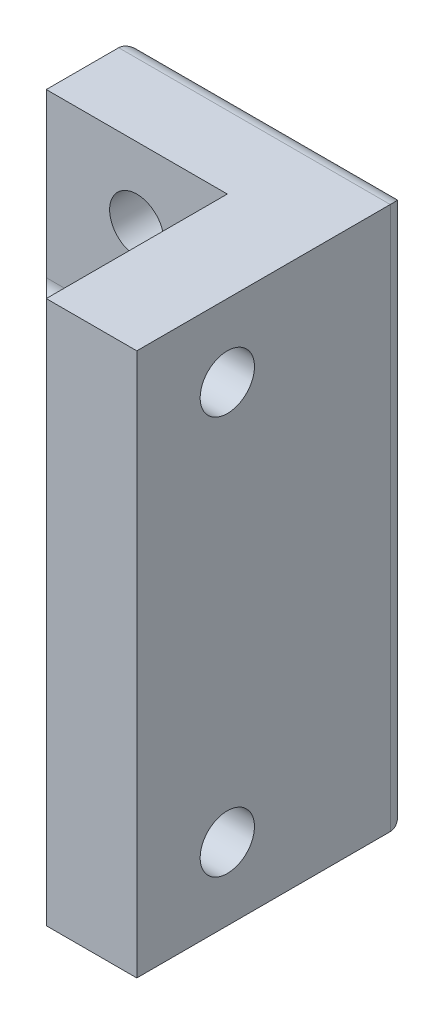
ISO-10303-21;
HEADER;
FILE_DESCRIPTION(('STEP AP214'),'2;1');
FILE_NAME('part.step','',(''),(''),'','','');
FILE_SCHEMA(('AUTOMOTIVE_DESIGN { 1 0 10303 214 1 1 1 1 }'));
ENDSEC;
DATA;
#1=APPLICATION_CONTEXT('core data for automotive mechanical design processes');
#2=APPLICATION_PROTOCOL_DEFINITION('international standard','automotive_design',2000,#1);
#3=PRODUCT_CONTEXT('',#1,'mechanical');
#4=PRODUCT('Part','Part','',(#3));
#5=PRODUCT_RELATED_PRODUCT_CATEGORY('part','',(#4));
#6=PRODUCT_DEFINITION_FORMATION('','',#4);
#7=PRODUCT_DEFINITION_CONTEXT('part definition',#1,'design');
#8=PRODUCT_DEFINITION('design','',#6,#7);
#9=PRODUCT_DEFINITION_SHAPE('','',#8);
#10=(LENGTH_UNIT() NAMED_UNIT(*) SI_UNIT(.MILLI.,.METRE.));
#11=(NAMED_UNIT(*) PLANE_ANGLE_UNIT() SI_UNIT($,.RADIAN.));
#12=(NAMED_UNIT(*) SI_UNIT($,.STERADIAN.) SOLID_ANGLE_UNIT());
#13=UNCERTAINTY_MEASURE_WITH_UNIT(LENGTH_MEASURE(1.E-05),#10,'distance_accuracy_value','');
#14=(GEOMETRIC_REPRESENTATION_CONTEXT(3) GLOBAL_UNCERTAINTY_ASSIGNED_CONTEXT((#13)) GLOBAL_UNIT_ASSIGNED_CONTEXT((#10,
#11,#12)) REPRESENTATION_CONTEXT('',''));
#15=CARTESIAN_POINT('',(0.,0.,0.));
#16=DIRECTION('',(0.,0.,1.));
#17=DIRECTION('',(1.,0.,0.));
#18=AXIS2_PLACEMENT_3D('',#15,#16,#17);
#19=CARTESIAN_POINT('',(5.,-15.,5.));
#20=DIRECTION('',(0.,0.,1.));
#21=DIRECTION('',(1.,0.,0.));
#22=AXIS2_PLACEMENT_3D('',#19,#20,#21);
#23=PLANE('',#22);
#24=CARTESIAN_POINT('',(0.,-11.,5.));
#25=DIRECTION('',(0.,0.,1.));
#26=DIRECTION('',(1.,0.,0.));
#27=AXIS2_PLACEMENT_3D('',#24,#25,#26);
#28=CIRCLE('',#27,1.5);
#29=CARTESIAN_POINT('',(1.5,-11.,5.));
#30=VERTEX_POINT('',#29);
#31=EDGE_CURVE('E319',#30,#30,#28,.T.);
#32=ORIENTED_EDGE('',*,*,#31,.F.);
#33=EDGE_LOOP('',(#32));
#34=FACE_BOUND('',#33,.T.);
#35=DIRECTION('',(0.,1.,0.));
#36=VECTOR('',#35,1.);
#37=CARTESIAN_POINT('',(5.,15.,5.));
#38=LINE('',#37,#36);
#39=CARTESIAN_POINT('',(5.,-15.,5.));
#40=VERTEX_POINT('',#39);
#41=CARTESIAN_POINT('',(5.,-6.,5.));
#42=VERTEX_POINT('',#41);
#43=EDGE_CURVE('E178',#40,#42,#38,.T.);
#44=ORIENTED_EDGE('',*,*,#43,.T.);
#45=DIRECTION('',(1.,0.,0.));
#46=VECTOR('',#45,1.);
#47=CARTESIAN_POINT('',(5.,-6.,5.));
#48=LINE('',#47,#46);
#49=CARTESIAN_POINT('',(-5.,-6.,5.));
#50=VERTEX_POINT('',#49);
#51=EDGE_CURVE('E288',#42,#50,#48,.F.);
#52=ORIENTED_EDGE('',*,*,#51,.T.);
#53=DIRECTION('',(0.,-1.,0.));
#54=VECTOR('',#53,1.);
#55=CARTESIAN_POINT('',(-5.,15.,5.));
#56=LINE('',#55,#54);
#57=CARTESIAN_POINT('',(-5.,-15.,5.));
#58=VERTEX_POINT('',#57);
#59=EDGE_CURVE('E231',#50,#58,#56,.T.);
#60=ORIENTED_EDGE('',*,*,#59,.T.);
#61=DIRECTION('',(1.,0.,0.));
#62=VECTOR('',#61,1.);
#63=CARTESIAN_POINT('',(-5.,-15.,5.));
#64=LINE('',#63,#62);
#65=EDGE_CURVE('E239',#58,#40,#64,.T.);
#66=ORIENTED_EDGE('',*,*,#65,.T.);
#67=EDGE_LOOP('',(#44,#52,#60,#66));
#68=FACE_BOUND('',#67,.T.);
#69=ADVANCED_FACE('F33',(#34,#68),#23,.T.);
#70=CARTESIAN_POINT('',(5.,-15.,0.));
#71=DIRECTION('',(-1.,0.,0.));
#72=DIRECTION('',(0.,-1.,0.));
#73=AXIS2_PLACEMENT_3D('',#70,#71,#72);
#74=PLANE('',#73);
#75=CARTESIAN_POINT('',(5.,-11.,10.));
#76=DIRECTION('',(-1.,0.,0.));
#77=DIRECTION('',(0.,-1.,0.));
#78=AXIS2_PLACEMENT_3D('',#75,#76,#77);
#79=CIRCLE('',#78,1.5);
#80=CARTESIAN_POINT('',(5.,-12.5,10.));
#81=VERTEX_POINT('',#80);
#82=EDGE_CURVE('E284',#81,#81,#79,.T.);
#83=ORIENTED_EDGE('',*,*,#82,.F.);
#84=EDGE_LOOP('',(#83));
#85=FACE_BOUND('',#84,.T.);
#86=DIRECTION('',(0.,-1.,0.));
#87=VECTOR('',#86,1.);
#88=CARTESIAN_POINT('',(5.,15.,15.));
#89=LINE('',#88,#87);
#90=CARTESIAN_POINT('',(5.,-6.,15.));
#91=VERTEX_POINT('',#90);
#92=CARTESIAN_POINT('',(5.,-15.,15.));
#93=VERTEX_POINT('',#92);
#94=EDGE_CURVE('E170',#91,#93,#89,.T.);
#95=ORIENTED_EDGE('',*,*,#94,.F.);
#96=DIRECTION('',(0.,0.,1.));
#97=VECTOR('',#96,1.);
#98=CARTESIAN_POINT('',(5.,-6.,0.));
#99=LINE('',#98,#97);
#100=EDGE_CURVE('E184',#91,#42,#99,.F.);
#101=ORIENTED_EDGE('',*,*,#100,.T.);
#102=ORIENTED_EDGE('',*,*,#43,.F.);
#103=DIRECTION('',(0.,0.,-1.));
#104=VECTOR('',#103,1.);
#105=CARTESIAN_POINT('',(5.,-15.,0.));
#106=LINE('',#105,#104);
#107=EDGE_CURVE('E141',#93,#40,#106,.T.);
#108=ORIENTED_EDGE('',*,*,#107,.F.);
#109=EDGE_LOOP('',(#95,#101,#102,#108));
#110=FACE_BOUND('',#109,.T.);
#111=ADVANCED_FACE('F293',(#85,#110),#74,.T.);
#112=CARTESIAN_POINT('',(-5.,15.,5.));
#113=DIRECTION('',(0.,-1.,0.));
#114=DIRECTION('',(0.,0.,-1.));
#115=AXIS2_PLACEMENT_3D('',#112,#113,#114);
#116=PLANE('',#115);
#117=DIRECTION('',(0.,0.,1.));
#118=VECTOR('',#117,1.);
#119=CARTESIAN_POINT('',(10.,15.,0.));
#120=LINE('',#119,#118);
#121=CARTESIAN_POINT('',(10.,15.,1.));
#122=VERTEX_POINT('',#121);
#123=CARTESIAN_POINT('',(10.,15.,15.));
#124=VERTEX_POINT('',#123);
#125=EDGE_CURVE('E130',#122,#124,#120,.T.);
#126=ORIENTED_EDGE('',*,*,#125,.F.);
#127=DIRECTION('',(-1.,0.,0.));
#128=VECTOR('',#127,1.);
#129=CARTESIAN_POINT('',(-5.,15.,1.));
#130=LINE('',#129,#128);
#131=CARTESIAN_POINT('',(-5.,15.,1.));
#132=VERTEX_POINT('',#131);
#133=EDGE_CURVE('E268',#122,#132,#130,.T.);
#134=ORIENTED_EDGE('',*,*,#133,.T.);
#135=DIRECTION('',(0.,0.,-1.));
#136=VECTOR('',#135,1.);
#137=CARTESIAN_POINT('',(-5.,15.,5.));
#138=LINE('',#137,#136);
#139=CARTESIAN_POINT('',(-5.,15.,5.));
#140=VERTEX_POINT('',#139);
#141=EDGE_CURVE('E230',#140,#132,#138,.T.);
#142=ORIENTED_EDGE('',*,*,#141,.F.);
#143=DIRECTION('',(-1.,0.,0.));
#144=VECTOR('',#143,1.);
#145=CARTESIAN_POINT('',(-5.,15.,5.));
#146=LINE('',#145,#144);
#147=CARTESIAN_POINT('',(5.,15.,5.));
#148=VERTEX_POINT('',#147);
#149=EDGE_CURVE('E228',#148,#140,#146,.T.);
#150=ORIENTED_EDGE('',*,*,#149,.F.);
#151=DIRECTION('',(0.,0.,1.));
#152=VECTOR('',#151,1.);
#153=CARTESIAN_POINT('',(5.,15.,0.));
#154=LINE('',#153,#152);
#155=CARTESIAN_POINT('',(5.,15.,15.));
#156=VERTEX_POINT('',#155);
#157=EDGE_CURVE('E148',#148,#156,#154,.T.);
#158=ORIENTED_EDGE('',*,*,#157,.T.);
#159=DIRECTION('',(-1.,0.,0.));
#160=VECTOR('',#159,1.);
#161=CARTESIAN_POINT('',(10.,15.,15.));
#162=LINE('',#161,#160);
#163=EDGE_CURVE('E144',#124,#156,#162,.T.);
#164=ORIENTED_EDGE('',*,*,#163,.F.);
#165=EDGE_LOOP('',(#126,#134,#142,#150,#158,#164));
#166=FACE_BOUND('',#165,.T.);
#167=ADVANCED_FACE('F145',(#166),#116,.F.);
#168=CARTESIAN_POINT('',(-5.,15.,5.));
#169=DIRECTION('',(1.,0.,0.));
#170=DIRECTION('',(0.,1.,0.));
#171=AXIS2_PLACEMENT_3D('',#168,#169,#170);
#172=PLANE('',#171);
#173=ORIENTED_EDGE('',*,*,#141,.T.);
#174=DIRECTION('',(0.,-1.,0.));
#175=VECTOR('',#174,1.);
#176=CARTESIAN_POINT('',(-5.,15.,1.));
#177=LINE('',#176,#175);
#178=CARTESIAN_POINT('',(-5.,-15.,1.));
#179=VERTEX_POINT('',#178);
#180=EDGE_CURVE('E236',#132,#179,#177,.T.);
#181=ORIENTED_EDGE('',*,*,#180,.T.);
#182=DIRECTION('',(0.,0.,-1.));
#183=VECTOR('',#182,1.);
#184=CARTESIAN_POINT('',(-5.,-15.,5.));
#185=LINE('',#184,#183);
#186=EDGE_CURVE('E237',#58,#179,#185,.T.);
#187=ORIENTED_EDGE('',*,*,#186,.F.);
#188=ORIENTED_EDGE('',*,*,#59,.F.);
#189=DIRECTION('',(0.,-1.,0.));
#190=VECTOR('',#189,1.);
#191=CARTESIAN_POINT('',(-5.,5.,5.));
#192=LINE('',#191,#190);
#193=CARTESIAN_POINT('',(-5.,6.,5.));
#194=VERTEX_POINT('',#193);
#195=EDGE_CURVE('E51',#194,#50,#192,.T.);
#196=ORIENTED_EDGE('',*,*,#195,.F.);
#197=EDGE_CURVE('E174',#140,#194,#56,.T.);
#198=ORIENTED_EDGE('',*,*,#197,.F.);
#199=EDGE_LOOP('',(#173,#181,#187,#188,#196,#198));
#200=FACE_BOUND('',#199,.T.);
#201=ADVANCED_FACE('F336',(#200),#172,.F.);
#202=CARTESIAN_POINT('',(-5.,-15.,5.));
#203=DIRECTION('',(0.,1.,0.));
#204=DIRECTION('',(0.,0.,1.));
#205=AXIS2_PLACEMENT_3D('',#202,#203,#204);
#206=PLANE('',#205);
#207=ORIENTED_EDGE('',*,*,#186,.T.);
#208=DIRECTION('',(1.,0.,0.));
#209=VECTOR('',#208,1.);
#210=CARTESIAN_POINT('',(-5.,-15.,1.));
#211=LINE('',#210,#209);
#212=CARTESIAN_POINT('',(10.,-15.,1.));
#213=VERTEX_POINT('',#212);
#214=EDGE_CURVE('E265',#179,#213,#211,.T.);
#215=ORIENTED_EDGE('',*,*,#214,.T.);
#216=DIRECTION('',(0.,0.,-1.));
#217=VECTOR('',#216,1.);
#218=CARTESIAN_POINT('',(10.,-15.,0.));
#219=LINE('',#218,#217);
#220=CARTESIAN_POINT('',(10.,-15.,15.));
#221=VERTEX_POINT('',#220);
#222=EDGE_CURVE('E158',#221,#213,#219,.T.);
#223=ORIENTED_EDGE('',*,*,#222,.F.);
#224=DIRECTION('',(-1.,0.,0.));
#225=VECTOR('',#224,1.);
#226=CARTESIAN_POINT('',(10.,-15.,15.));
#227=LINE('',#226,#225);
#228=EDGE_CURVE('E153',#221,#93,#227,.T.);
#229=ORIENTED_EDGE('',*,*,#228,.T.);
#230=ORIENTED_EDGE('',*,*,#107,.T.);
#231=ORIENTED_EDGE('',*,*,#65,.F.);
#232=EDGE_LOOP('',(#207,#215,#223,#229,#230,#231));
#233=FACE_BOUND('',#232,.T.);
#234=ADVANCED_FACE('F328',(#233),#206,.F.);
#235=ORIENTED_EDGE('',*,*,#197,.T.);
#236=DIRECTION('',(1.,0.,0.));
#237=VECTOR('',#236,1.);
#238=CARTESIAN_POINT('',(5.,6.,5.));
#239=LINE('',#238,#237);
#240=CARTESIAN_POINT('',(5.,6.,5.));
#241=VERTEX_POINT('',#240);
#242=EDGE_CURVE('E186',#194,#241,#239,.T.);
#243=ORIENTED_EDGE('',*,*,#242,.T.);
#244=EDGE_CURVE('E152',#241,#148,#38,.T.);
#245=ORIENTED_EDGE('',*,*,#244,.T.);
#246=ORIENTED_EDGE('',*,*,#149,.T.);
#247=EDGE_LOOP('',(#235,#243,#245,#246));
#248=FACE_BOUND('',#247,.T.);
#249=CARTESIAN_POINT('',(0.,11.,5.));
#250=DIRECTION('',(0.,0.,1.));
#251=DIRECTION('',(1.,0.,0.));
#252=AXIS2_PLACEMENT_3D('',#249,#250,#251);
#253=CIRCLE('',#252,1.5);
#254=CARTESIAN_POINT('',(1.5,11.,5.));
#255=VERTEX_POINT('',#254);
#256=EDGE_CURVE('E171',#255,#255,#253,.T.);
#257=ORIENTED_EDGE('',*,*,#256,.F.);
#258=EDGE_LOOP('',(#257));
#259=FACE_BOUND('',#258,.T.);
#260=ADVANCED_FACE('F224',(#248,#259),#23,.T.);
#261=CARTESIAN_POINT('',(5.,-15.,0.));
#262=DIRECTION('',(0.,0.,1.));
#263=DIRECTION('',(1.,0.,0.));
#264=AXIS2_PLACEMENT_3D('',#261,#262,#263);
#265=PLANE('',#264);
#266=DIRECTION('',(1.,0.,0.));
#267=VECTOR('',#266,1.);
#268=CARTESIAN_POINT('',(5.,-14.,0.));
#269=LINE('',#268,#267);
#270=CARTESIAN_POINT('',(9.,-14.,0.));
#271=VERTEX_POINT('',#270);
#272=CARTESIAN_POINT('',(-4.,-14.,0.));
#273=VERTEX_POINT('',#272);
#274=EDGE_CURVE('E260',#271,#273,#269,.F.);
#275=ORIENTED_EDGE('',*,*,#274,.T.);
#276=DIRECTION('',(0.,-1.,0.));
#277=VECTOR('',#276,1.);
#278=CARTESIAN_POINT('',(-4.,-15.,0.));
#279=LINE('',#278,#277);
#280=CARTESIAN_POINT('',(-4.,14.,0.));
#281=VERTEX_POINT('',#280);
#282=EDGE_CURVE('E262',#273,#281,#279,.F.);
#283=ORIENTED_EDGE('',*,*,#282,.T.);
#284=DIRECTION('',(-1.,0.,0.));
#285=VECTOR('',#284,1.);
#286=CARTESIAN_POINT('',(5.,14.,0.));
#287=LINE('',#286,#285);
#288=CARTESIAN_POINT('',(9.,14.,0.));
#289=VERTEX_POINT('',#288);
#290=EDGE_CURVE('E256',#281,#289,#287,.F.);
#291=ORIENTED_EDGE('',*,*,#290,.T.);
#292=DIRECTION('',(0.,1.,0.));
#293=VECTOR('',#292,1.);
#294=CARTESIAN_POINT('',(9.,-15.,0.));
#295=LINE('',#294,#293);
#296=EDGE_CURVE('E258',#289,#271,#295,.F.);
#297=ORIENTED_EDGE('',*,*,#296,.T.);
#298=EDGE_LOOP('',(#275,#283,#291,#297));
#299=FACE_BOUND('',#298,.T.);
#300=CARTESIAN_POINT('',(0.,11.,0.));
#301=DIRECTION('',(0.,0.,1.));
#302=DIRECTION('',(1.,0.,0.));
#303=AXIS2_PLACEMENT_3D('',#300,#301,#302);
#304=CIRCLE('',#303,2.5);
#305=CARTESIAN_POINT('',(2.5,11.,0.));
#306=VERTEX_POINT('',#305);
#307=EDGE_CURVE('E253',#306,#306,#304,.T.);
#308=ORIENTED_EDGE('',*,*,#307,.T.);
#309=EDGE_LOOP('',(#308));
#310=FACE_BOUND('',#309,.T.);
#311=CARTESIAN_POINT('',(0.,-11.,0.));
#312=DIRECTION('',(0.,0.,1.));
#313=DIRECTION('',(1.,0.,0.));
#314=AXIS2_PLACEMENT_3D('',#311,#312,#313);
#315=CIRCLE('',#314,2.5);
#316=CARTESIAN_POINT('',(2.5,-11.,0.));
#317=VERTEX_POINT('',#316);
#318=EDGE_CURVE('E250',#317,#317,#315,.T.);
#319=ORIENTED_EDGE('',*,*,#318,.T.);
#320=EDGE_LOOP('',(#319));
#321=FACE_BOUND('',#320,.T.);
#322=ADVANCED_FACE('F327',(#299,#310,#321),#265,.F.);
#323=CARTESIAN_POINT('',(5.,11.,10.));
#324=DIRECTION('',(-1.,0.,0.));
#325=DIRECTION('',(0.,-1.,0.));
#326=AXIS2_PLACEMENT_3D('',#323,#324,#325);
#327=CIRCLE('',#326,1.5);
#328=CARTESIAN_POINT('',(5.,9.5,10.));
#329=VERTEX_POINT('',#328);
#330=EDGE_CURVE('E314',#329,#329,#327,.T.);
#331=ORIENTED_EDGE('',*,*,#330,.F.);
#332=EDGE_LOOP('',(#331));
#333=FACE_BOUND('',#332,.T.);
#334=ORIENTED_EDGE('',*,*,#244,.F.);
#335=DIRECTION('',(0.,0.,1.));
#336=VECTOR('',#335,1.);
#337=CARTESIAN_POINT('',(5.,6.,15.));
#338=LINE('',#337,#336);
#339=CARTESIAN_POINT('',(5.,6.,15.));
#340=VERTEX_POINT('',#339);
#341=EDGE_CURVE('E193',#241,#340,#338,.T.);
#342=ORIENTED_EDGE('',*,*,#341,.T.);
#343=EDGE_CURVE('E165',#156,#340,#89,.T.);
#344=ORIENTED_EDGE('',*,*,#343,.F.);
#345=ORIENTED_EDGE('',*,*,#157,.F.);
#346=EDGE_LOOP('',(#334,#342,#344,#345));
#347=FACE_BOUND('',#346,.T.);
#348=ADVANCED_FACE('F226',(#333,#347),#74,.T.);
#349=CARTESIAN_POINT('',(10.,15.,15.));
#350=DIRECTION('',(0.,0.,-1.));
#351=DIRECTION('',(-1.,0.,0.));
#352=AXIS2_PLACEMENT_3D('',#349,#350,#351);
#353=PLANE('',#352);
#354=ORIENTED_EDGE('',*,*,#343,.T.);
#355=DIRECTION('',(0.,-1.,0.));
#356=VECTOR('',#355,1.);
#357=CARTESIAN_POINT('',(5.,5.,15.));
#358=LINE('',#357,#356);
#359=EDGE_CURVE('E311',#340,#91,#358,.T.);
#360=ORIENTED_EDGE('',*,*,#359,.T.);
#361=ORIENTED_EDGE('',*,*,#94,.T.);
#362=ORIENTED_EDGE('',*,*,#228,.F.);
#363=DIRECTION('',(0.,-1.,0.));
#364=VECTOR('',#363,1.);
#365=CARTESIAN_POINT('',(10.,15.,15.));
#366=LINE('',#365,#364);
#367=EDGE_CURVE('E135',#124,#221,#366,.T.);
#368=ORIENTED_EDGE('',*,*,#367,.F.);
#369=ORIENTED_EDGE('',*,*,#163,.T.);
#370=EDGE_LOOP('',(#354,#360,#361,#362,#368,#369));
#371=FACE_BOUND('',#370,.T.);
#372=ADVANCED_FACE('F155',(#371),#353,.F.);
#373=CARTESIAN_POINT('',(10.,-15.,0.));
#374=DIRECTION('',(-1.,0.,0.));
#375=DIRECTION('',(0.,-1.,0.));
#376=AXIS2_PLACEMENT_3D('',#373,#374,#375);
#377=PLANE('',#376);
#378=CARTESIAN_POINT('',(10.,-11.,10.));
#379=DIRECTION('',(-1.,0.,0.));
#380=DIRECTION('',(0.,-1.,0.));
#381=AXIS2_PLACEMENT_3D('',#378,#379,#380);
#382=CIRCLE('',#381,1.5);
#383=CARTESIAN_POINT('',(10.,-12.5,10.));
#384=VERTEX_POINT('',#383);
#385=EDGE_CURVE('E601',#384,#384,#382,.T.);
#386=ORIENTED_EDGE('',*,*,#385,.T.);
#387=EDGE_LOOP('',(#386));
#388=FACE_BOUND('',#387,.T.);
#389=CARTESIAN_POINT('',(10.,11.,10.));
#390=DIRECTION('',(-1.,0.,0.));
#391=DIRECTION('',(0.,-1.,0.));
#392=AXIS2_PLACEMENT_3D('',#389,#390,#391);
#393=CIRCLE('',#392,1.5);
#394=CARTESIAN_POINT('',(10.,9.5,10.));
#395=VERTEX_POINT('',#394);
#396=EDGE_CURVE('E308',#395,#395,#393,.T.);
#397=ORIENTED_EDGE('',*,*,#396,.T.);
#398=EDGE_LOOP('',(#397));
#399=FACE_BOUND('',#398,.T.);
#400=ORIENTED_EDGE('',*,*,#222,.T.);
#401=DIRECTION('',(0.,1.,0.));
#402=VECTOR('',#401,1.);
#403=CARTESIAN_POINT('',(10.,-15.,1.));
#404=LINE('',#403,#402);
#405=EDGE_CURVE('E138',#213,#122,#404,.T.);
#406=ORIENTED_EDGE('',*,*,#405,.T.);
#407=ORIENTED_EDGE('',*,*,#125,.T.);
#408=ORIENTED_EDGE('',*,*,#367,.T.);
#409=EDGE_LOOP('',(#400,#406,#407,#408));
#410=FACE_BOUND('',#409,.T.);
#411=ADVANCED_FACE('F133',(#388,#399,#410),#377,.F.);
#412=CARTESIAN_POINT('',(0.,11.,0.));
#413=DIRECTION('',(0.,0.,1.));
#414=DIRECTION('',(1.,0.,0.));
#415=AXIS2_PLACEMENT_3D('',#412,#413,#414);
#416=CYLINDRICAL_SURFACE('',#415,1.5);
#417=CARTESIAN_POINT('',(0.,11.,1.));
#418=DIRECTION('',(0.,0.,1.));
#419=DIRECTION('',(1.,0.,0.));
#420=AXIS2_PLACEMENT_3D('',#417,#418,#419);
#421=CIRCLE('',#420,1.5);
#422=CARTESIAN_POINT('',(1.5,11.,1.));
#423=VERTEX_POINT('',#422);
#424=EDGE_CURVE('E270',#423,#423,#421,.F.);
#425=ORIENTED_EDGE('',*,*,#424,.T.);
#426=EDGE_LOOP('',(#425));
#427=FACE_BOUND('',#426,.T.);
#428=ORIENTED_EDGE('',*,*,#256,.T.);
#429=EDGE_LOOP('',(#428));
#430=FACE_BOUND('',#429,.T.);
#431=ADVANCED_FACE('F325',(#427,#430),#416,.F.);
#432=CARTESIAN_POINT('',(0.,-11.,0.));
#433=DIRECTION('',(0.,0.,1.));
#434=DIRECTION('',(1.,0.,0.));
#435=AXIS2_PLACEMENT_3D('',#432,#433,#434);
#436=CYLINDRICAL_SURFACE('',#435,1.5);
#437=CARTESIAN_POINT('',(0.,-11.,1.));
#438=DIRECTION('',(0.,0.,1.));
#439=DIRECTION('',(1.,0.,0.));
#440=AXIS2_PLACEMENT_3D('',#437,#438,#439);
#441=CIRCLE('',#440,1.5);
#442=CARTESIAN_POINT('',(1.5,-11.,1.));
#443=VERTEX_POINT('',#442);
#444=EDGE_CURVE('E273',#443,#443,#441,.F.);
#445=ORIENTED_EDGE('',*,*,#444,.T.);
#446=EDGE_LOOP('',(#445));
#447=FACE_BOUND('',#446,.T.);
#448=ORIENTED_EDGE('',*,*,#31,.T.);
#449=EDGE_LOOP('',(#448));
#450=FACE_BOUND('',#449,.T.);
#451=ADVANCED_FACE('F348',(#447,#450),#436,.F.);
#452=CARTESIAN_POINT('',(5.,5.,15.));
#453=DIRECTION('',(-0.707106781186548,0.,0.707106781186548));
#454=DIRECTION('',(0.707106781186548,0.,0.707106781186548));
#455=AXIS2_PLACEMENT_3D('',#452,#453,#454);
#456=PLANE('',#455);
#457=ORIENTED_EDGE('',*,*,#195,.T.);
#458=CARTESIAN_POINT('',(-4.,-6.,6.));
#459=DIRECTION('',(-0.707106781186548,0.,0.707106781186548));
#460=DIRECTION('',(0.707106781186548,0.,0.707106781186548));
#461=AXIS2_PLACEMENT_3D('',#458,#459,#460);
#462=ELLIPSE('',#461,1.41421356237309,1.);
#463=CARTESIAN_POINT('',(-4.,-5.,6.));
#464=VERTEX_POINT('',#463);
#465=EDGE_CURVE('E196',#50,#464,#462,.F.);
#466=ORIENTED_EDGE('',*,*,#465,.T.);
#467=DIRECTION('',(-0.707106781186548,0.,-0.707106781186548));
#468=VECTOR('',#467,1.);
#469=CARTESIAN_POINT('',(5.,-5.,15.));
#470=LINE('',#469,#468);
#471=CARTESIAN_POINT('',(4.,-5.,14.));
#472=VERTEX_POINT('',#471);
#473=EDGE_CURVE('E305',#472,#464,#470,.T.);
#474=ORIENTED_EDGE('',*,*,#473,.F.);
#475=CARTESIAN_POINT('',(4.,-6.,14.));
#476=DIRECTION('',(-0.707106781186548,0.,0.707106781186548));
#477=DIRECTION('',(0.707106781186548,0.,0.707106781186548));
#478=AXIS2_PLACEMENT_3D('',#475,#476,#477);
#479=ELLIPSE('',#478,1.41421356237309,1.);
#480=EDGE_CURVE('E198',#472,#91,#479,.F.);
#481=ORIENTED_EDGE('',*,*,#480,.T.);
#482=ORIENTED_EDGE('',*,*,#359,.F.);
#483=CARTESIAN_POINT('',(4.,6.,14.));
#484=DIRECTION('',(-0.707106781186548,0.,0.707106781186548));
#485=DIRECTION('',(-0.707106781186548,0.,-0.707106781186548));
#486=AXIS2_PLACEMENT_3D('',#483,#484,#485);
#487=ELLIPSE('',#486,1.41421356237309,1.);
#488=CARTESIAN_POINT('',(4.,5.,14.));
#489=VERTEX_POINT('',#488);
#490=EDGE_CURVE('E11',#340,#489,#487,.F.);
#491=ORIENTED_EDGE('',*,*,#490,.T.);
#492=DIRECTION('',(-0.707106781186548,0.,-0.707106781186548));
#493=VECTOR('',#492,1.);
#494=CARTESIAN_POINT('',(5.,5.,15.));
#495=LINE('',#494,#493);
#496=CARTESIAN_POINT('',(-4.,5.,6.));
#497=VERTEX_POINT('',#496);
#498=EDGE_CURVE('E307',#489,#497,#495,.T.);
#499=ORIENTED_EDGE('',*,*,#498,.T.);
#500=CARTESIAN_POINT('',(-4.,6.,6.));
#501=DIRECTION('',(-0.707106781186548,0.,0.707106781186548));
#502=DIRECTION('',(-0.707106781186548,0.,-0.707106781186548));
#503=AXIS2_PLACEMENT_3D('',#500,#501,#502);
#504=ELLIPSE('',#503,1.41421356237309,1.);
#505=EDGE_CURVE('E43',#497,#194,#504,.F.);
#506=ORIENTED_EDGE('',*,*,#505,.T.);
#507=EDGE_LOOP('',(#457,#466,#474,#481,#482,#491,#499,#506));
#508=FACE_BOUND('',#507,.T.);
#509=ADVANCED_FACE('F350',(#508),#456,.T.);
#510=CARTESIAN_POINT('',(5.,5.,5.));
#511=DIRECTION('',(0.,1.,0.));
#512=DIRECTION('',(0.,0.,1.));
#513=AXIS2_PLACEMENT_3D('',#510,#511,#512);
#514=PLANE('',#513);
#515=DIRECTION('',(0.,0.,1.));
#516=VECTOR('',#515,1.);
#517=CARTESIAN_POINT('',(4.,5.,5.));
#518=LINE('',#517,#516);
#519=CARTESIAN_POINT('',(4.,5.,6.));
#520=VERTEX_POINT('',#519);
#521=EDGE_CURVE('E189',#489,#520,#518,.F.);
#522=ORIENTED_EDGE('',*,*,#521,.T.);
#523=DIRECTION('',(1.,0.,0.));
#524=VECTOR('',#523,1.);
#525=CARTESIAN_POINT('',(-5.,5.,6.));
#526=LINE('',#525,#524);
#527=EDGE_CURVE('E191',#520,#497,#526,.F.);
#528=ORIENTED_EDGE('',*,*,#527,.T.);
#529=ORIENTED_EDGE('',*,*,#498,.F.);
#530=EDGE_LOOP('',(#522,#528,#529));
#531=FACE_BOUND('',#530,.T.);
#532=ADVANCED_FACE('F357',(#531),#514,.T.);
#533=CARTESIAN_POINT('',(5.,-5.,5.));
#534=DIRECTION('',(0.,1.,0.));
#535=DIRECTION('',(0.,0.,1.));
#536=AXIS2_PLACEMENT_3D('',#533,#534,#535);
#537=PLANE('',#536);
#538=ORIENTED_EDGE('',*,*,#473,.T.);
#539=DIRECTION('',(1.,0.,0.));
#540=VECTOR('',#539,1.);
#541=CARTESIAN_POINT('',(5.,-5.,6.));
#542=LINE('',#541,#540);
#543=CARTESIAN_POINT('',(4.,-5.,6.));
#544=VERTEX_POINT('',#543);
#545=EDGE_CURVE('E286',#464,#544,#542,.T.);
#546=ORIENTED_EDGE('',*,*,#545,.T.);
#547=DIRECTION('',(0.,0.,1.));
#548=VECTOR('',#547,1.);
#549=CARTESIAN_POINT('',(4.,-5.,5.));
#550=LINE('',#549,#548);
#551=EDGE_CURVE('E275',#544,#472,#550,.T.);
#552=ORIENTED_EDGE('',*,*,#551,.T.);
#553=EDGE_LOOP('',(#538,#546,#552));
#554=FACE_BOUND('',#553,.T.);
#555=ADVANCED_FACE('F304',(#554),#537,.F.);
#556=CARTESIAN_POINT('',(10.,11.,10.));
#557=DIRECTION('',(-1.,0.,0.));
#558=DIRECTION('',(0.,-1.,0.));
#559=AXIS2_PLACEMENT_3D('',#556,#557,#558);
#560=CYLINDRICAL_SURFACE('',#559,1.5);
#561=ORIENTED_EDGE('',*,*,#396,.F.);
#562=EDGE_LOOP('',(#561));
#563=FACE_BOUND('',#562,.T.);
#564=ORIENTED_EDGE('',*,*,#330,.T.);
#565=EDGE_LOOP('',(#564));
#566=FACE_BOUND('',#565,.T.);
#567=ADVANCED_FACE('F515',(#563,#566),#560,.F.);
#568=CARTESIAN_POINT('',(10.,-11.,10.));
#569=DIRECTION('',(-1.,0.,0.));
#570=DIRECTION('',(0.,-1.,0.));
#571=AXIS2_PLACEMENT_3D('',#568,#569,#570);
#572=CYLINDRICAL_SURFACE('',#571,1.5);
#573=ORIENTED_EDGE('',*,*,#385,.F.);
#574=EDGE_LOOP('',(#573));
#575=FACE_BOUND('',#574,.T.);
#576=ORIENTED_EDGE('',*,*,#82,.T.);
#577=EDGE_LOOP('',(#576));
#578=FACE_BOUND('',#577,.T.);
#579=ADVANCED_FACE('F398',(#575,#578),#572,.F.);
#580=CARTESIAN_POINT('',(9.,-15.,1.));
#581=DIRECTION('',(0.,1.,0.));
#582=DIRECTION('',(-1.,0.,0.));
#583=AXIS2_PLACEMENT_3D('',#580,#581,#582);
#584=CYLINDRICAL_SURFACE('',#583,1.);
#585=CARTESIAN_POINT('',(9.,-14.,1.));
#586=DIRECTION('',(0.707106781186547,0.707106781186548,0.));
#587=DIRECTION('',(-0.707106781186548,0.707106781186547,0.));
#588=AXIS2_PLACEMENT_3D('',#585,#586,#587);
#589=ELLIPSE('',#588,1.4142135623731,1.);
#590=EDGE_CURVE('E278',#271,#213,#589,.F.);
#591=ORIENTED_EDGE('',*,*,#590,.F.);
#592=ORIENTED_EDGE('',*,*,#296,.F.);
#593=CARTESIAN_POINT('',(9.,14.,1.));
#594=DIRECTION('',(-0.707106781186548,0.707106781186547,0.));
#595=DIRECTION('',(-0.707106781186547,-0.707106781186548,0.));
#596=AXIS2_PLACEMENT_3D('',#593,#594,#595);
#597=ELLIPSE('',#596,1.41421356237309,1.);
#598=EDGE_CURVE('E281',#122,#289,#597,.T.);
#599=ORIENTED_EDGE('',*,*,#598,.F.);
#600=ORIENTED_EDGE('',*,*,#405,.F.);
#601=EDGE_LOOP('',(#591,#592,#599,#600));
#602=FACE_BOUND('',#601,.T.);
#603=ADVANCED_FACE('F392',(#602),#584,.T.);
#604=CARTESIAN_POINT('',(-5.,14.,1.));
#605=DIRECTION('',(-1.,0.,0.));
#606=DIRECTION('',(0.,0.,1.));
#607=AXIS2_PLACEMENT_3D('',#604,#605,#606);
#608=CYLINDRICAL_SURFACE('',#607,1.);
#609=ORIENTED_EDGE('',*,*,#598,.T.);
#610=ORIENTED_EDGE('',*,*,#290,.F.);
#611=CARTESIAN_POINT('',(-4.,14.,1.));
#612=DIRECTION('',(-0.707106781186547,-0.707106781186548,0.));
#613=DIRECTION('',(-0.707106781186548,0.707106781186547,0.));
#614=AXIS2_PLACEMENT_3D('',#611,#612,#613);
#615=ELLIPSE('',#614,1.4142135623731,1.);
#616=EDGE_CURVE('E209',#132,#281,#615,.T.);
#617=ORIENTED_EDGE('',*,*,#616,.F.);
#618=ORIENTED_EDGE('',*,*,#133,.F.);
#619=EDGE_LOOP('',(#609,#610,#617,#618));
#620=FACE_BOUND('',#619,.T.);
#621=ADVANCED_FACE('F397',(#620),#608,.T.);
#622=CARTESIAN_POINT('',(-5.,-14.,1.));
#623=DIRECTION('',(1.,0.,0.));
#624=DIRECTION('',(0.,0.,-1.));
#625=AXIS2_PLACEMENT_3D('',#622,#623,#624);
#626=CYLINDRICAL_SURFACE('',#625,1.);
#627=ORIENTED_EDGE('',*,*,#590,.T.);
#628=ORIENTED_EDGE('',*,*,#214,.F.);
#629=CARTESIAN_POINT('',(-4.,-14.,1.));
#630=DIRECTION('',(0.707106781186548,-0.707106781186547,0.));
#631=DIRECTION('',(0.707106781186547,0.707106781186548,0.));
#632=AXIS2_PLACEMENT_3D('',#629,#630,#631);
#633=ELLIPSE('',#632,1.41421356237309,1.);
#634=EDGE_CURVE('E203',#273,#179,#633,.F.);
#635=ORIENTED_EDGE('',*,*,#634,.F.);
#636=ORIENTED_EDGE('',*,*,#274,.F.);
#637=EDGE_LOOP('',(#627,#628,#635,#636));
#638=FACE_BOUND('',#637,.T.);
#639=ADVANCED_FACE('F410',(#638),#626,.T.);
#640=CARTESIAN_POINT('',(-4.,15.,1.));
#641=DIRECTION('',(0.,-1.,0.));
#642=DIRECTION('',(1.,0.,0.));
#643=AXIS2_PLACEMENT_3D('',#640,#641,#642);
#644=CYLINDRICAL_SURFACE('',#643,1.);
#645=ORIENTED_EDGE('',*,*,#616,.T.);
#646=ORIENTED_EDGE('',*,*,#282,.F.);
#647=ORIENTED_EDGE('',*,*,#634,.T.);
#648=ORIENTED_EDGE('',*,*,#180,.F.);
#649=EDGE_LOOP('',(#645,#646,#647,#648));
#650=FACE_BOUND('',#649,.T.);
#651=ADVANCED_FACE('F420',(#650),#644,.T.);
#652=CARTESIAN_POINT('',(0.,11.,1.));
#653=DIRECTION('',(0.,0.,1.));
#654=DIRECTION('',(1.,0.,0.));
#655=AXIS2_PLACEMENT_3D('',#652,#653,#654);
#656=TOROIDAL_SURFACE('',#655,2.5,1.);
#657=ORIENTED_EDGE('',*,*,#424,.F.);
#658=EDGE_LOOP('',(#657));
#659=FACE_BOUND('',#658,.T.);
#660=ORIENTED_EDGE('',*,*,#307,.F.);
#661=EDGE_LOOP('',(#660));
#662=FACE_BOUND('',#661,.T.);
#663=ADVANCED_FACE('F430',(#659,#662),#656,.T.);
#664=CARTESIAN_POINT('',(0.,-11.,1.));
#665=DIRECTION('',(0.,0.,1.));
#666=DIRECTION('',(1.,0.,0.));
#667=AXIS2_PLACEMENT_3D('',#664,#665,#666);
#668=TOROIDAL_SURFACE('',#667,2.5,1.);
#669=ORIENTED_EDGE('',*,*,#444,.F.);
#670=EDGE_LOOP('',(#669));
#671=FACE_BOUND('',#670,.T.);
#672=ORIENTED_EDGE('',*,*,#318,.F.);
#673=EDGE_LOOP('',(#672));
#674=FACE_BOUND('',#673,.T.);
#675=ADVANCED_FACE('F440',(#671,#674),#668,.T.);
#676=CARTESIAN_POINT('',(4.,-6.,5.));
#677=DIRECTION('',(0.,0.,1.));
#678=DIRECTION('',(1.,0.,0.));
#679=AXIS2_PLACEMENT_3D('',#676,#677,#678);
#680=CYLINDRICAL_SURFACE('',#679,1.);
#681=ORIENTED_EDGE('',*,*,#480,.F.);
#682=ORIENTED_EDGE('',*,*,#551,.F.);
#683=CARTESIAN_POINT('',(4.,-6.,6.));
#684=DIRECTION('',(0.707106781186547,0.,0.707106781186547));
#685=DIRECTION('',(0.707106781186547,0.,-0.707106781186547));
#686=AXIS2_PLACEMENT_3D('',#683,#684,#685);
#687=ELLIPSE('',#686,1.41421356237309,1.);
#688=EDGE_CURVE('E202',#42,#544,#687,.T.);
#689=ORIENTED_EDGE('',*,*,#688,.F.);
#690=ORIENTED_EDGE('',*,*,#100,.F.);
#691=EDGE_LOOP('',(#681,#682,#689,#690));
#692=FACE_BOUND('',#691,.T.);
#693=ADVANCED_FACE('F300',(#692),#680,.F.);
#694=CARTESIAN_POINT('',(5.,-6.,6.));
#695=DIRECTION('',(1.,0.,0.));
#696=DIRECTION('',(0.,0.,-1.));
#697=AXIS2_PLACEMENT_3D('',#694,#695,#696);
#698=CYLINDRICAL_SURFACE('',#697,1.);
#699=ORIENTED_EDGE('',*,*,#465,.F.);
#700=ORIENTED_EDGE('',*,*,#51,.F.);
#701=ORIENTED_EDGE('',*,*,#688,.T.);
#702=ORIENTED_EDGE('',*,*,#545,.F.);
#703=EDGE_LOOP('',(#699,#700,#701,#702));
#704=FACE_BOUND('',#703,.T.);
#705=ADVANCED_FACE('F299',(#704),#698,.F.);
#706=CARTESIAN_POINT('',(4.,6.,0.));
#707=DIRECTION('',(0.,0.,-1.));
#708=DIRECTION('',(-1.,0.,0.));
#709=AXIS2_PLACEMENT_3D('',#706,#707,#708);
#710=CYLINDRICAL_SURFACE('',#709,1.);
#711=ORIENTED_EDGE('',*,*,#490,.F.);
#712=ORIENTED_EDGE('',*,*,#341,.F.);
#713=CARTESIAN_POINT('',(4.,6.,6.));
#714=DIRECTION('',(-0.707106781186547,0.,-0.707106781186547));
#715=DIRECTION('',(-0.707106781186547,0.,0.707106781186547));
#716=AXIS2_PLACEMENT_3D('',#713,#714,#715);
#717=ELLIPSE('',#716,1.41421356237309,1.);
#718=EDGE_CURVE('E37',#520,#241,#717,.F.);
#719=ORIENTED_EDGE('',*,*,#718,.F.);
#720=ORIENTED_EDGE('',*,*,#521,.F.);
#721=EDGE_LOOP('',(#711,#712,#719,#720));
#722=FACE_BOUND('',#721,.T.);
#723=ADVANCED_FACE('F35',(#722),#710,.F.);
#724=CARTESIAN_POINT('',(5.,6.,6.));
#725=DIRECTION('',(-1.,0.,0.));
#726=DIRECTION('',(0.,0.,1.));
#727=AXIS2_PLACEMENT_3D('',#724,#725,#726);
#728=CYLINDRICAL_SURFACE('',#727,1.);
#729=ORIENTED_EDGE('',*,*,#505,.F.);
#730=ORIENTED_EDGE('',*,*,#527,.F.);
#731=ORIENTED_EDGE('',*,*,#718,.T.);
#732=ORIENTED_EDGE('',*,*,#242,.F.);
#733=EDGE_LOOP('',(#729,#730,#731,#732));
#734=FACE_BOUND('',#733,.T.);
#735=ADVANCED_FACE('F217',(#734),#728,.F.);
#736=CLOSED_SHELL('',(#69,#111,#167,#201,#234,#260,#322,#348,#372,#411,#431,#451,#509,#532,#555,
#567,#579,#603,#621,#639,#651,#663,#675,#693,#705,#723,#735));
#737=MANIFOLD_SOLID_BREP('B2',#736);
#738=ADVANCED_BREP_SHAPE_REPRESENTATION('',(#18,#737),#14);
#739=SHAPE_DEFINITION_REPRESENTATION(#9,#738);
ENDSEC;
END-ISO-10303-21;
